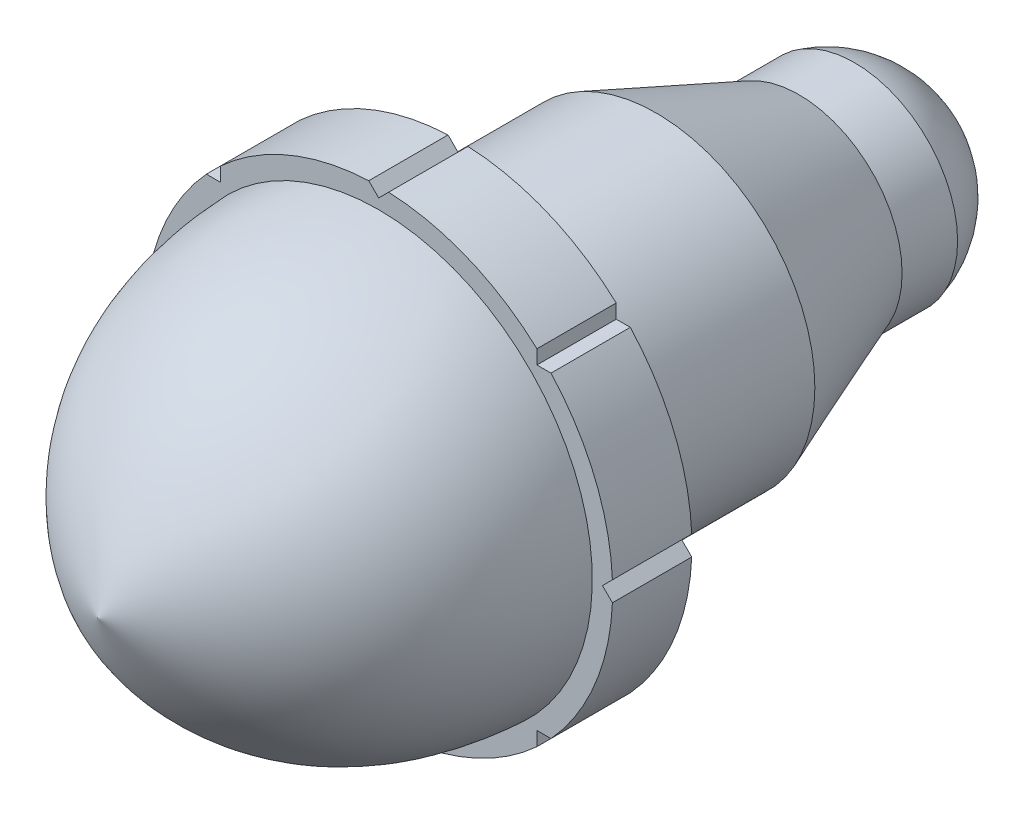
ISO-10303-21;
HEADER;
FILE_DESCRIPTION(('STEP AP214'),'2;1');
FILE_NAME('part.step','',(''),(''),'','','');
FILE_SCHEMA(('AUTOMOTIVE_DESIGN { 1 0 10303 214 1 1 1 1 }'));
ENDSEC;
DATA;
#1=APPLICATION_CONTEXT('core data for automotive mechanical design processes');
#2=APPLICATION_PROTOCOL_DEFINITION('international standard','automotive_design',2000,#1);
#3=PRODUCT_CONTEXT('',#1,'mechanical');
#4=PRODUCT('Part','Part','',(#3));
#5=PRODUCT_RELATED_PRODUCT_CATEGORY('part','',(#4));
#6=PRODUCT_DEFINITION_FORMATION('','',#4);
#7=PRODUCT_DEFINITION_CONTEXT('part definition',#1,'design');
#8=PRODUCT_DEFINITION('design','',#6,#7);
#9=PRODUCT_DEFINITION_SHAPE('','',#8);
#10=(LENGTH_UNIT() NAMED_UNIT(*) SI_UNIT(.MILLI.,.METRE.));
#11=(NAMED_UNIT(*) PLANE_ANGLE_UNIT() SI_UNIT($,.RADIAN.));
#12=(NAMED_UNIT(*) SI_UNIT($,.STERADIAN.) SOLID_ANGLE_UNIT());
#13=UNCERTAINTY_MEASURE_WITH_UNIT(LENGTH_MEASURE(1.E-05),#10,'distance_accuracy_value','');
#14=(GEOMETRIC_REPRESENTATION_CONTEXT(3) GLOBAL_UNCERTAINTY_ASSIGNED_CONTEXT((#13)) GLOBAL_UNIT_ASSIGNED_CONTEXT((#10,
#11,#12)) REPRESENTATION_CONTEXT('',''));
#15=CARTESIAN_POINT('',(0.,0.,0.));
#16=DIRECTION('',(0.,0.,1.));
#17=DIRECTION('',(1.,0.,0.));
#18=AXIS2_PLACEMENT_3D('',#15,#16,#17);
#19=CARTESIAN_POINT('',(0.,0.,9.99924451199761));
#20=DIRECTION('',(0.,0.,1.));
#21=DIRECTION('',(1.,0.,0.));
#22=AXIS2_PLACEMENT_3D('',#19,#20,#21);
#23=CYLINDRICAL_SURFACE('',#22,7.493);
#24=CARTESIAN_POINT('',(0.,0.,0.));
#25=DIRECTION('',(0.,0.,1.));
#26=DIRECTION('',(1.,0.,0.));
#27=AXIS2_PLACEMENT_3D('',#24,#25,#26);
#28=CIRCLE('',#27,7.493);
#29=CARTESIAN_POINT('',(5.51870276522275,-5.06842863115609,0.));
#30=VERTEX_POINT('',#29);
#31=CARTESIAN_POINT('',(7.48623240369248,-0.318391893591497,0.));
#32=VERTEX_POINT('',#31);
#33=EDGE_CURVE('E436',#30,#32,#28,.T.);
#34=ORIENTED_EDGE('',*,*,#33,.T.);
#35=DIRECTION('',(0.,0.,1.));
#36=VECTOR('',#35,1.);
#37=CARTESIAN_POINT('',(7.48623240369248,-0.318391893591497,-15.24));
#38=LINE('',#37,#36);
#39=CARTESIAN_POINT('',(7.48623240369248,-0.318391893591497,2.54));
#40=VERTEX_POINT('',#39);
#41=EDGE_CURVE('E323',#32,#40,#38,.T.);
#42=ORIENTED_EDGE('',*,*,#41,.T.);
#43=CARTESIAN_POINT('',(0.,0.,2.54));
#44=DIRECTION('',(0.,0.,1.));
#45=DIRECTION('',(1.,0.,0.));
#46=AXIS2_PLACEMENT_3D('',#43,#44,#45);
#47=CIRCLE('',#46,7.493);
#48=CARTESIAN_POINT('',(5.51870276522275,-5.06842863115609,2.54));
#49=VERTEX_POINT('',#48);
#50=EDGE_CURVE('E474',#49,#40,#47,.T.);
#51=ORIENTED_EDGE('',*,*,#50,.F.);
#52=DIRECTION('',(0.,0.,1.));
#53=VECTOR('',#52,1.);
#54=CARTESIAN_POINT('',(5.51870276522275,-5.06842863115609,-15.24));
#55=LINE('',#54,#53);
#56=EDGE_CURVE('E340',#30,#49,#55,.T.);
#57=ORIENTED_EDGE('',*,*,#56,.F.);
#58=EDGE_LOOP('',(#34,#42,#51,#57));
#59=FACE_BOUND('',#58,.T.);
#60=ADVANCED_FACE('F55',(#59),#23,.T.);
#61=CARTESIAN_POINT('',(0.318391893591472,-7.48623240369248,0.));
#62=VERTEX_POINT('',#61);
#63=CARTESIAN_POINT('',(5.06842863115603,-5.5187027652228,0.));
#64=VERTEX_POINT('',#63);
#65=EDGE_CURVE('E438',#62,#64,#28,.T.);
#66=ORIENTED_EDGE('',*,*,#65,.T.);
#67=DIRECTION('',(0.,0.,1.));
#68=VECTOR('',#67,1.);
#69=CARTESIAN_POINT('',(5.06842863115603,-5.5187027652228,-15.24));
#70=LINE('',#69,#68);
#71=CARTESIAN_POINT('',(5.06842863115603,-5.5187027652228,2.54));
#72=VERTEX_POINT('',#71);
#73=EDGE_CURVE('E337',#64,#72,#70,.T.);
#74=ORIENTED_EDGE('',*,*,#73,.T.);
#75=CARTESIAN_POINT('',(0.318391893591472,-7.48623240369248,2.54));
#76=VERTEX_POINT('',#75);
#77=EDGE_CURVE('E473',#76,#72,#47,.T.);
#78=ORIENTED_EDGE('',*,*,#77,.F.);
#79=DIRECTION('',(0.,0.,1.));
#80=VECTOR('',#79,1.);
#81=CARTESIAN_POINT('',(0.318391893591472,-7.48623240369248,-15.24));
#82=LINE('',#81,#80);
#83=EDGE_CURVE('E352',#62,#76,#82,.T.);
#84=ORIENTED_EDGE('',*,*,#83,.F.);
#85=EDGE_LOOP('',(#66,#74,#78,#84));
#86=FACE_BOUND('',#85,.T.);
#87=ADVANCED_FACE('F427',(#86),#23,.T.);
#88=CARTESIAN_POINT('',(-5.06842863115611,-5.51870276522273,0.));
#89=VERTEX_POINT('',#88);
#90=CARTESIAN_POINT('',(-0.318391893591471,-7.48623240369248,0.));
#91=VERTEX_POINT('',#90);
#92=EDGE_CURVE('E440',#89,#91,#28,.T.);
#93=ORIENTED_EDGE('',*,*,#92,.T.);
#94=DIRECTION('',(0.,0.,1.));
#95=VECTOR('',#94,1.);
#96=CARTESIAN_POINT('',(-0.318391893591471,-7.48623240369248,-15.24));
#97=LINE('',#96,#95);
#98=CARTESIAN_POINT('',(-0.318391893591471,-7.48623240369248,2.54));
#99=VERTEX_POINT('',#98);
#100=EDGE_CURVE('E350',#91,#99,#97,.T.);
#101=ORIENTED_EDGE('',*,*,#100,.T.);
#102=CARTESIAN_POINT('',(-5.06842863115611,-5.51870276522273,2.54));
#103=VERTEX_POINT('',#102);
#104=EDGE_CURVE('E255',#103,#99,#47,.T.);
#105=ORIENTED_EDGE('',*,*,#104,.F.);
#106=DIRECTION('',(0.,0.,1.));
#107=VECTOR('',#106,1.);
#108=CARTESIAN_POINT('',(-5.06842863115611,-5.51870276522273,-15.24));
#109=LINE('',#108,#107);
#110=EDGE_CURVE('E363',#89,#103,#109,.T.);
#111=ORIENTED_EDGE('',*,*,#110,.F.);
#112=EDGE_LOOP('',(#93,#101,#105,#111));
#113=FACE_BOUND('',#112,.T.);
#114=ADVANCED_FACE('F433',(#113),#23,.T.);
#115=CARTESIAN_POINT('',(-7.48623240369248,-0.318391893591393,0.));
#116=VERTEX_POINT('',#115);
#117=CARTESIAN_POINT('',(-5.51870276522282,-5.06842863115601,0.));
#118=VERTEX_POINT('',#117);
#119=EDGE_CURVE('E452',#116,#118,#28,.T.);
#120=ORIENTED_EDGE('',*,*,#119,.T.);
#121=DIRECTION('',(0.,0.,1.));
#122=VECTOR('',#121,1.);
#123=CARTESIAN_POINT('',(-5.51870276522282,-5.06842863115601,-15.24));
#124=LINE('',#123,#122);
#125=CARTESIAN_POINT('',(-5.51870276522282,-5.06842863115601,2.54));
#126=VERTEX_POINT('',#125);
#127=EDGE_CURVE('E361',#118,#126,#124,.T.);
#128=ORIENTED_EDGE('',*,*,#127,.T.);
#129=CARTESIAN_POINT('',(-7.48623240369248,-0.318391893591393,2.54));
#130=VERTEX_POINT('',#129);
#131=EDGE_CURVE('E249',#130,#126,#47,.T.);
#132=ORIENTED_EDGE('',*,*,#131,.F.);
#133=DIRECTION('',(0.,0.,1.));
#134=VECTOR('',#133,1.);
#135=CARTESIAN_POINT('',(-7.48623240369248,-0.318391893591393,-15.24));
#136=LINE('',#135,#134);
#137=EDGE_CURVE('E240',#116,#130,#136,.T.);
#138=ORIENTED_EDGE('',*,*,#137,.F.);
#139=EDGE_LOOP('',(#120,#128,#132,#138));
#140=FACE_BOUND('',#139,.T.);
#141=ADVANCED_FACE('F495',(#140),#23,.T.);
#142=CARTESIAN_POINT('',(-5.51870276522271,5.06842863115613,0.));
#143=VERTEX_POINT('',#142);
#144=CARTESIAN_POINT('',(-7.48623240369247,0.318391893591549,0.));
#145=VERTEX_POINT('',#144);
#146=EDGE_CURVE('E239',#143,#145,#28,.T.);
#147=ORIENTED_EDGE('',*,*,#146,.T.);
#148=DIRECTION('',(0.,0.,1.));
#149=VECTOR('',#148,1.);
#150=CARTESIAN_POINT('',(-7.48623240369247,0.318391893591549,-15.24));
#151=LINE('',#150,#149);
#152=CARTESIAN_POINT('',(-7.48623240369247,0.318391893591549,2.54));
#153=VERTEX_POINT('',#152);
#154=EDGE_CURVE('E222',#145,#153,#151,.T.);
#155=ORIENTED_EDGE('',*,*,#154,.T.);
#156=CARTESIAN_POINT('',(-5.51870276522271,5.06842863115613,2.54));
#157=VERTEX_POINT('',#156);
#158=EDGE_CURVE('E237',#157,#153,#47,.T.);
#159=ORIENTED_EDGE('',*,*,#158,.F.);
#160=DIRECTION('',(0.,0.,1.));
#161=VECTOR('',#160,1.);
#162=CARTESIAN_POINT('',(-5.51870276522271,5.06842863115613,-15.24));
#163=LINE('',#162,#161);
#164=EDGE_CURVE('E484',#143,#157,#163,.T.);
#165=ORIENTED_EDGE('',*,*,#164,.F.);
#166=EDGE_LOOP('',(#147,#155,#159,#165));
#167=FACE_BOUND('',#166,.T.);
#168=ADVANCED_FACE('F235',(#167),#23,.T.);
#169=CARTESIAN_POINT('',(-0.318391893591472,7.48623240369248,0.));
#170=VERTEX_POINT('',#169);
#171=CARTESIAN_POINT('',(-5.06842863115599,5.51870276522283,0.));
#172=VERTEX_POINT('',#171);
#173=EDGE_CURVE('E258',#170,#172,#28,.T.);
#174=ORIENTED_EDGE('',*,*,#173,.T.);
#175=DIRECTION('',(0.,0.,1.));
#176=VECTOR('',#175,1.);
#177=CARTESIAN_POINT('',(-5.06842863115599,5.51870276522283,-15.24));
#178=LINE('',#177,#176);
#179=CARTESIAN_POINT('',(-5.06842863115599,5.51870276522283,2.54));
#180=VERTEX_POINT('',#179);
#181=EDGE_CURVE('E482',#172,#180,#178,.T.);
#182=ORIENTED_EDGE('',*,*,#181,.T.);
#183=CARTESIAN_POINT('',(-0.318391893591472,7.48623240369248,2.54));
#184=VERTEX_POINT('',#183);
#185=EDGE_CURVE('E248',#184,#180,#47,.T.);
#186=ORIENTED_EDGE('',*,*,#185,.F.);
#187=DIRECTION('',(0.,0.,1.));
#188=VECTOR('',#187,1.);
#189=CARTESIAN_POINT('',(-0.318391893591472,7.48623240369248,-15.24));
#190=LINE('',#189,#188);
#191=EDGE_CURVE('E385',#170,#184,#190,.T.);
#192=ORIENTED_EDGE('',*,*,#191,.F.);
#193=EDGE_LOOP('',(#174,#182,#186,#192));
#194=FACE_BOUND('',#193,.T.);
#195=ADVANCED_FACE('F424',(#194),#23,.T.);
#196=CARTESIAN_POINT('',(7.48623240369248,0.318391893591445,2.54));
#197=VERTEX_POINT('',#196);
#198=CARTESIAN_POINT('',(5.51870276522278,5.06842863115605,2.54));
#199=VERTEX_POINT('',#198);
#200=EDGE_CURVE('E322',#197,#199,#47,.T.);
#201=ORIENTED_EDGE('',*,*,#200,.F.);
#202=DIRECTION('',(0.,0.,1.));
#203=VECTOR('',#202,1.);
#204=CARTESIAN_POINT('',(7.48623240369248,0.318391893591445,-15.24));
#205=LINE('',#204,#203);
#206=CARTESIAN_POINT('',(7.48623240369248,0.318391893591445,0.));
#207=VERTEX_POINT('',#206);
#208=EDGE_CURVE('E315',#207,#197,#205,.T.);
#209=ORIENTED_EDGE('',*,*,#208,.F.);
#210=CARTESIAN_POINT('',(5.51870276522278,5.06842863115605,0.));
#211=VERTEX_POINT('',#210);
#212=EDGE_CURVE('E312',#207,#211,#28,.T.);
#213=ORIENTED_EDGE('',*,*,#212,.T.);
#214=DIRECTION('',(0.,0.,1.));
#215=VECTOR('',#214,1.);
#216=CARTESIAN_POINT('',(5.51870276522278,5.06842863115605,-15.24));
#217=LINE('',#216,#215);
#218=EDGE_CURVE('E371',#211,#199,#217,.T.);
#219=ORIENTED_EDGE('',*,*,#218,.T.);
#220=EDGE_LOOP('',(#201,#209,#213,#219));
#221=FACE_BOUND('',#220,.T.);
#222=ADVANCED_FACE('F319',(#221),#23,.T.);
#223=CARTESIAN_POINT('',(0.,0.,2.54));
#224=DIRECTION('',(0.,0.,-1.));
#225=DIRECTION('',(-1.,0.,0.));
#226=AXIS2_PLACEMENT_3D('',#223,#224,#225);
#227=PLANE('',#226);
#228=CARTESIAN_POINT('',(0.,0.,2.54));
#229=DIRECTION('',(0.,0.,-1.));
#230=DIRECTION('',(-1.,0.,0.));
#231=AXIS2_PLACEMENT_3D('',#228,#229,#230);
#232=CIRCLE('',#231,6.84268102020201);
#233=CARTESIAN_POINT('',(-6.84268102020201,0.,2.54));
#234=VERTEX_POINT('',#233);
#235=EDGE_CURVE('E394',#234,#234,#232,.T.);
#236=ORIENTED_EDGE('',*,*,#235,.T.);
#237=EDGE_LOOP('',(#236));
#238=FACE_BOUND('',#237,.T.);
#239=ORIENTED_EDGE('',*,*,#50,.T.);
#240=DIRECTION('',(0.707106781186546,-0.707106781186548,0.));
#241=VECTOR('',#240,1.);
#242=CARTESIAN_POINT('',(7.167840510101,0.,2.54));
#243=LINE('',#242,#241);
#244=CARTESIAN_POINT('',(7.167840510101,0.,2.54));
#245=VERTEX_POINT('',#244);
#246=EDGE_CURVE('E339',#245,#40,#243,.T.);
#247=ORIENTED_EDGE('',*,*,#246,.F.);
#248=DIRECTION('',(-0.707106781186551,-0.707106781186544,0.));
#249=VECTOR('',#248,1.);
#250=CARTESIAN_POINT('',(7.167840510101,0.,2.54));
#251=LINE('',#250,#249);
#252=EDGE_CURVE('E328',#197,#245,#251,.T.);
#253=ORIENTED_EDGE('',*,*,#252,.F.);
#254=ORIENTED_EDGE('',*,*,#200,.T.);
#255=DIRECTION('',(1.,0.,0.));
#256=VECTOR('',#255,1.);
#257=CARTESIAN_POINT('',(5.06842863115607,5.06842863115605,2.54));
#258=LINE('',#257,#256);
#259=CARTESIAN_POINT('',(5.06842863115607,5.06842863115605,2.54));
#260=VERTEX_POINT('',#259);
#261=EDGE_CURVE('E325',#260,#199,#258,.T.);
#262=ORIENTED_EDGE('',*,*,#261,.F.);
#263=DIRECTION('',(0.,-1.,0.));
#264=VECTOR('',#263,1.);
#265=CARTESIAN_POINT('',(5.06842863115607,5.06842863115605,2.54));
#266=LINE('',#265,#264);
#267=CARTESIAN_POINT('',(5.06842863115607,5.51870276522276,2.54));
#268=VERTEX_POINT('',#267);
#269=EDGE_CURVE('E368',#268,#260,#266,.T.);
#270=ORIENTED_EDGE('',*,*,#269,.F.);
#271=CARTESIAN_POINT('',(0.318391893591471,7.48623240369248,2.54));
#272=VERTEX_POINT('',#271);
#273=EDGE_CURVE('E253',#268,#272,#47,.T.);
#274=ORIENTED_EDGE('',*,*,#273,.T.);
#275=DIRECTION('',(0.707106781186546,0.707106781186549,0.));
#276=VECTOR('',#275,1.);
#277=CARTESIAN_POINT('',(0.,7.167840510101,2.54));
#278=LINE('',#277,#276);
#279=CARTESIAN_POINT('',(0.,7.167840510101,2.54));
#280=VERTEX_POINT('',#279);
#281=EDGE_CURVE('E374',#280,#272,#278,.T.);
#282=ORIENTED_EDGE('',*,*,#281,.F.);
#283=DIRECTION('',(0.707106781186546,-0.707106781186549,0.));
#284=VECTOR('',#283,1.);
#285=CARTESIAN_POINT('',(0.,7.167840510101,2.54));
#286=LINE('',#285,#284);
#287=EDGE_CURVE('E380',#184,#280,#286,.T.);
#288=ORIENTED_EDGE('',*,*,#287,.F.);
#289=ORIENTED_EDGE('',*,*,#185,.T.);
#290=DIRECTION('',(0.,1.,0.));
#291=VECTOR('',#290,1.);
#292=CARTESIAN_POINT('',(-5.068428631156,5.06842863115612,2.54));
#293=LINE('',#292,#291);
#294=CARTESIAN_POINT('',(-5.068428631156,5.06842863115612,2.54));
#295=VERTEX_POINT('',#294);
#296=EDGE_CURVE('E488',#295,#180,#293,.T.);
#297=ORIENTED_EDGE('',*,*,#296,.F.);
#298=DIRECTION('',(1.,0.,0.));
#299=VECTOR('',#298,1.);
#300=CARTESIAN_POINT('',(-5.068428631156,5.06842863115612,2.54));
#301=LINE('',#300,#299);
#302=EDGE_CURVE('E247',#157,#295,#301,.T.);
#303=ORIENTED_EDGE('',*,*,#302,.F.);
#304=ORIENTED_EDGE('',*,*,#158,.T.);
#305=DIRECTION('',(-0.707106781186541,0.707106781186553,0.));
#306=VECTOR('',#305,1.);
#307=CARTESIAN_POINT('',(-7.167840510101,0.,2.54));
#308=LINE('',#307,#306);
#309=CARTESIAN_POINT('',(-7.167840510101,0.,2.54));
#310=VERTEX_POINT('',#309);
#311=EDGE_CURVE('E218',#310,#153,#308,.T.);
#312=ORIENTED_EDGE('',*,*,#311,.F.);
#313=DIRECTION('',(0.707106781186556,0.707106781186539,0.));
#314=VECTOR('',#313,1.);
#315=CARTESIAN_POINT('',(-7.167840510101,0.,2.54));
#316=LINE('',#315,#314);
#317=EDGE_CURVE('E229',#130,#310,#316,.T.);
#318=ORIENTED_EDGE('',*,*,#317,.F.);
#319=ORIENTED_EDGE('',*,*,#131,.T.);
#320=DIRECTION('',(-1.,0.,0.));
#321=VECTOR('',#320,1.);
#322=CARTESIAN_POINT('',(-5.06842863115611,-5.06842863115602,2.54));
#323=LINE('',#322,#321);
#324=CARTESIAN_POINT('',(-5.06842863115611,-5.06842863115602,2.54));
#325=VERTEX_POINT('',#324);
#326=EDGE_CURVE('E356',#325,#126,#323,.T.);
#327=ORIENTED_EDGE('',*,*,#326,.F.);
#328=DIRECTION('',(0.,1.,0.));
#329=VECTOR('',#328,1.);
#330=CARTESIAN_POINT('',(-5.06842863115611,-5.06842863115602,2.54));
#331=LINE('',#330,#329);
#332=EDGE_CURVE('E358',#103,#325,#331,.T.);
#333=ORIENTED_EDGE('',*,*,#332,.F.);
#334=ORIENTED_EDGE('',*,*,#104,.T.);
#335=DIRECTION('',(-0.707106781186546,-0.707106781186549,0.));
#336=VECTOR('',#335,1.);
#337=CARTESIAN_POINT('',(0.,-7.167840510101,2.54));
#338=LINE('',#337,#336);
#339=CARTESIAN_POINT('',(0.,-7.167840510101,2.54));
#340=VERTEX_POINT('',#339);
#341=EDGE_CURVE('E344',#340,#99,#338,.T.);
#342=ORIENTED_EDGE('',*,*,#341,.F.);
#343=DIRECTION('',(-0.707106781186546,0.707106781186549,0.));
#344=VECTOR('',#343,1.);
#345=CARTESIAN_POINT('',(0.,-7.167840510101,2.54));
#346=LINE('',#345,#344);
#347=EDGE_CURVE('E346',#76,#340,#346,.T.);
#348=ORIENTED_EDGE('',*,*,#347,.F.);
#349=ORIENTED_EDGE('',*,*,#77,.T.);
#350=DIRECTION('',(0.,-1.,0.));
#351=VECTOR('',#350,1.);
#352=CARTESIAN_POINT('',(5.06842863115603,-5.06842863115609,2.54));
#353=LINE('',#352,#351);
#354=CARTESIAN_POINT('',(5.06842863115603,-5.06842863115609,2.54));
#355=VERTEX_POINT('',#354);
#356=EDGE_CURVE('E332',#355,#72,#353,.T.);
#357=ORIENTED_EDGE('',*,*,#356,.F.);
#358=DIRECTION('',(-1.,0.,0.));
#359=VECTOR('',#358,1.);
#360=CARTESIAN_POINT('',(5.06842863115603,-5.06842863115609,2.54));
#361=LINE('',#360,#359);
#362=EDGE_CURVE('E334',#49,#355,#361,.T.);
#363=ORIENTED_EDGE('',*,*,#362,.F.);
#364=EDGE_LOOP('',(#239,#247,#253,#254,#262,#270,#274,#282,#288,#289,#297,#303,#304,#312,#318,
#319,#327,#333,#334,#342,#348,#349,#357,#363));
#365=FACE_BOUND('',#364,.T.);
#366=ADVANCED_FACE('F244',(#238,#365),#227,.F.);
#367=ORIENTED_EDGE('',*,*,#273,.F.);
#368=DIRECTION('',(0.,0.,1.));
#369=VECTOR('',#368,1.);
#370=CARTESIAN_POINT('',(5.06842863115607,5.51870276522276,-15.24));
#371=LINE('',#370,#369);
#372=CARTESIAN_POINT('',(5.06842863115607,5.51870276522276,0.));
#373=VERTEX_POINT('',#372);
#374=EDGE_CURVE('E375',#373,#268,#371,.T.);
#375=ORIENTED_EDGE('',*,*,#374,.F.);
#376=CARTESIAN_POINT('',(0.318391893591471,7.48623240369248,0.));
#377=VERTEX_POINT('',#376);
#378=EDGE_CURVE('E441',#373,#377,#28,.T.);
#379=ORIENTED_EDGE('',*,*,#378,.T.);
#380=DIRECTION('',(0.,0.,1.));
#381=VECTOR('',#380,1.);
#382=CARTESIAN_POINT('',(0.318391893591471,7.48623240369248,-15.24));
#383=LINE('',#382,#381);
#384=EDGE_CURVE('E383',#377,#272,#383,.T.);
#385=ORIENTED_EDGE('',*,*,#384,.T.);
#386=EDGE_LOOP('',(#367,#375,#379,#385));
#387=FACE_BOUND('',#386,.T.);
#388=ADVANCED_FACE('F416',(#387),#23,.T.);
#389=CARTESIAN_POINT('',(0.,7.493,0.));
#390=DIRECTION('',(0.,0.,1.));
#391=DIRECTION('',(1.,0.,0.));
#392=AXIS2_PLACEMENT_3D('',#389,#390,#391);
#393=PLANE('',#392);
#394=DIRECTION('',(-0.707106781186551,-0.707106781186544,0.));
#395=VECTOR('',#394,1.);
#396=CARTESIAN_POINT('',(7.33042025505048,0.162579744949445,0.));
#397=LINE('',#396,#395);
#398=CARTESIAN_POINT('',(7.167840510101,0.,0.));
#399=VERTEX_POINT('',#398);
#400=EDGE_CURVE('E63',#207,#399,#397,.T.);
#401=ORIENTED_EDGE('',*,*,#400,.T.);
#402=DIRECTION('',(0.707106781186547,-0.707106781186549,0.));
#403=VECTOR('',#402,1.);
#404=CARTESIAN_POINT('',(-0.162579744949501,7.3304202550505,0.));
#405=LINE('',#404,#403);
#406=EDGE_CURVE('E13',#399,#32,#405,.T.);
#407=ORIENTED_EDGE('',*,*,#406,.T.);
#408=ORIENTED_EDGE('',*,*,#33,.F.);
#409=DIRECTION('',(-1.,0.,0.));
#410=VECTOR('',#409,1.);
#411=CARTESIAN_POINT('',(0.,-5.06842863115605,0.));
#412=LINE('',#411,#410);
#413=CARTESIAN_POINT('',(5.06842863115603,-5.06842863115609,0.));
#414=VERTEX_POINT('',#413);
#415=EDGE_CURVE('E299',#30,#414,#412,.T.);
#416=ORIENTED_EDGE('',*,*,#415,.T.);
#417=DIRECTION('',(0.,-1.,0.));
#418=VECTOR('',#417,1.);
#419=CARTESIAN_POINT('',(5.06842863115607,7.49299999999998,0.));
#420=LINE('',#419,#418);
#421=EDGE_CURVE('E302',#414,#64,#420,.T.);
#422=ORIENTED_EDGE('',*,*,#421,.T.);
#423=ORIENTED_EDGE('',*,*,#65,.F.);
#424=DIRECTION('',(-0.707106781186546,0.707106781186549,0.));
#425=VECTOR('',#424,1.);
#426=CARTESIAN_POINT('',(-7.3304202550505,0.162579744949529,0.));
#427=LINE('',#426,#425);
#428=CARTESIAN_POINT('',(0.,-7.167840510101,0.));
#429=VERTEX_POINT('',#428);
#430=EDGE_CURVE('E293',#62,#429,#427,.T.);
#431=ORIENTED_EDGE('',*,*,#430,.T.);
#432=DIRECTION('',(-0.707106781186546,-0.707106781186549,0.));
#433=VECTOR('',#432,1.);
#434=CARTESIAN_POINT('',(7.3304202550505,0.162579744949529,0.));
#435=LINE('',#434,#433);
#436=EDGE_CURVE('E296',#429,#91,#435,.T.);
#437=ORIENTED_EDGE('',*,*,#436,.T.);
#438=ORIENTED_EDGE('',*,*,#92,.F.);
#439=DIRECTION('',(0.,1.,0.));
#440=VECTOR('',#439,1.);
#441=CARTESIAN_POINT('',(-5.06842863115597,7.49300000000005,0.));
#442=LINE('',#441,#440);
#443=CARTESIAN_POINT('',(-5.06842863115611,-5.06842863115602,0.));
#444=VERTEX_POINT('',#443);
#445=EDGE_CURVE('E287',#89,#444,#442,.T.);
#446=ORIENTED_EDGE('',*,*,#445,.T.);
#447=DIRECTION('',(-1.,0.,0.));
#448=VECTOR('',#447,1.);
#449=CARTESIAN_POINT('',(0.,-5.06842863115605,0.));
#450=LINE('',#449,#448);
#451=EDGE_CURVE('E290',#444,#118,#450,.T.);
#452=ORIENTED_EDGE('',*,*,#451,.T.);
#453=ORIENTED_EDGE('',*,*,#119,.F.);
#454=DIRECTION('',(0.707106781186556,0.707106781186539,0.));
#455=VECTOR('',#454,1.);
#456=CARTESIAN_POINT('',(0.162579744949551,7.33042025505044,0.));
#457=LINE('',#456,#455);
#458=CARTESIAN_POINT('',(-7.167840510101,0.,0.));
#459=VERTEX_POINT('',#458);
#460=EDGE_CURVE('E282',#116,#459,#457,.T.);
#461=ORIENTED_EDGE('',*,*,#460,.T.);
#462=DIRECTION('',(-0.707106781186542,0.707106781186554,0.));
#463=VECTOR('',#462,1.);
#464=CARTESIAN_POINT('',(-7.33042025505052,0.162579744949601,0.));
#465=LINE('',#464,#463);
#466=EDGE_CURVE('E285',#459,#145,#465,.T.);
#467=ORIENTED_EDGE('',*,*,#466,.T.);
#468=ORIENTED_EDGE('',*,*,#146,.F.);
#469=DIRECTION('',(1.,0.,0.));
#470=VECTOR('',#469,1.);
#471=CARTESIAN_POINT('',(0.,5.06842863115605,0.));
#472=LINE('',#471,#470);
#473=CARTESIAN_POINT('',(-5.068428631156,5.06842863115612,0.));
#474=VERTEX_POINT('',#473);
#475=EDGE_CURVE('E276',#143,#474,#472,.T.);
#476=ORIENTED_EDGE('',*,*,#475,.T.);
#477=DIRECTION('',(0.,1.,0.));
#478=VECTOR('',#477,1.);
#479=CARTESIAN_POINT('',(-5.06842863115598,7.49300000000005,0.));
#480=LINE('',#479,#478);
#481=EDGE_CURVE('E279',#474,#172,#480,.T.);
#482=ORIENTED_EDGE('',*,*,#481,.T.);
#483=ORIENTED_EDGE('',*,*,#173,.F.);
#484=DIRECTION('',(0.707106781186546,-0.707106781186549,0.));
#485=VECTOR('',#484,1.);
#486=CARTESIAN_POINT('',(-0.162579744949498,7.3304202550505,0.));
#487=LINE('',#486,#485);
#488=CARTESIAN_POINT('',(0.,7.167840510101,0.));
#489=VERTEX_POINT('',#488);
#490=EDGE_CURVE('E252',#170,#489,#487,.T.);
#491=ORIENTED_EDGE('',*,*,#490,.T.);
#492=DIRECTION('',(0.707106781186546,0.707106781186549,0.));
#493=VECTOR('',#492,1.);
#494=CARTESIAN_POINT('',(0.162579744949498,7.3304202550505,0.));
#495=LINE('',#494,#493);
#496=EDGE_CURVE('E267',#489,#377,#495,.T.);
#497=ORIENTED_EDGE('',*,*,#496,.T.);
#498=ORIENTED_EDGE('',*,*,#378,.F.);
#499=DIRECTION('',(0.,-1.,0.));
#500=VECTOR('',#499,1.);
#501=CARTESIAN_POINT('',(5.06842863115608,7.49299999999998,0.));
#502=LINE('',#501,#500);
#503=CARTESIAN_POINT('',(5.06842863115607,5.06842863115605,0.));
#504=VERTEX_POINT('',#503);
#505=EDGE_CURVE('E270',#373,#504,#502,.T.);
#506=ORIENTED_EDGE('',*,*,#505,.T.);
#507=DIRECTION('',(1.,0.,0.));
#508=VECTOR('',#507,1.);
#509=CARTESIAN_POINT('',(0.,5.06842863115605,0.));
#510=LINE('',#509,#508);
#511=EDGE_CURVE('E273',#504,#211,#510,.T.);
#512=ORIENTED_EDGE('',*,*,#511,.T.);
#513=ORIENTED_EDGE('',*,*,#212,.F.);
#514=EDGE_LOOP('',(#401,#407,#408,#416,#422,#423,#431,#437,#438,#446,#452,#453,#461,#467,#468,
#476,#482,#483,#491,#497,#498,#506,#512,#513));
#515=FACE_BOUND('',#514,.T.);
#516=CARTESIAN_POINT('',(0.,0.,0.));
#517=DIRECTION('',(0.,0.,1.));
#518=DIRECTION('',(1.,0.,0.));
#519=AXIS2_PLACEMENT_3D('',#516,#517,#518);
#520=CIRCLE('',#519,5.08);
#521=CARTESIAN_POINT('',(5.08,0.,0.));
#522=VERTEX_POINT('',#521);
#523=EDGE_CURVE('E442',#522,#522,#520,.T.);
#524=ORIENTED_EDGE('',*,*,#523,.T.);
#525=EDGE_LOOP('',(#524));
#526=FACE_BOUND('',#525,.T.);
#527=ADVANCED_FACE('F307',(#515,#526),#393,.F.);
#528=CARTESIAN_POINT('',(0.,0.,9.99924451199761));
#529=DIRECTION('',(0.,0.,1.));
#530=DIRECTION('',(1.,0.,0.));
#531=AXIS2_PLACEMENT_3D('',#528,#529,#530);
#532=CYLINDRICAL_SURFACE('',#531,5.08);
#533=CARTESIAN_POINT('',(0.,0.,-6.35));
#534=DIRECTION('',(0.,0.,1.));
#535=DIRECTION('',(1.,0.,0.));
#536=AXIS2_PLACEMENT_3D('',#533,#534,#535);
#537=CIRCLE('',#536,5.08);
#538=CARTESIAN_POINT('',(5.08,0.,-6.35));
#539=VERTEX_POINT('',#538);
#540=EDGE_CURVE('E263',#539,#539,#537,.T.);
#541=ORIENTED_EDGE('',*,*,#540,.T.);
#542=EDGE_LOOP('',(#541));
#543=FACE_BOUND('',#542,.T.);
#544=ORIENTED_EDGE('',*,*,#523,.F.);
#545=EDGE_LOOP('',(#544));
#546=FACE_BOUND('',#545,.T.);
#547=ADVANCED_FACE('F408',(#543,#546),#532,.T.);
#548=CARTESIAN_POINT('',(0.,6.84268102020201,2.54));
#549=CARTESIAN_POINT('',(0.,6.52533298328885,9.18957974912331));
#550=CARTESIAN_POINT('',(0.,0.,11.5311980628352));
#551=B_SPLINE_CURVE_WITH_KNOTS('',2,(#548,#549,#550),.UNSPECIFIED.,.F.,.F.,(3,3),(0.,1.),.UNSPECIFIED.);
#552=CARTESIAN_POINT('',(0.,0.,0.));
#553=DIRECTION('',(0.,0.,-1.));
#554=AXIS1_PLACEMENT('',#552,#553);
#555=SURFACE_OF_REVOLUTION('',#551,#554);
#556=CARTESIAN_POINT('',(0.,0.,11.5311980628352));
#557=VERTEX_POINT('',#556);
#558=VERTEX_LOOP('',#557);
#559=FACE_BOUND('',#558,.T.);
#560=ORIENTED_EDGE('',*,*,#235,.F.);
#561=EDGE_LOOP('',(#560));
#562=FACE_BOUND('',#561,.T.);
#563=ADVANCED_FACE('F403',(#559,#562),#555,.F.);
#564=CARTESIAN_POINT('',(0.,0.,14.8107368778698));
#565=DIRECTION('',(0.,0.,1.));
#566=DIRECTION('',(1.,0.,0.));
#567=AXIS2_PLACEMENT_3D('',#564,#565,#566);
#568=CYLINDRICAL_SURFACE('',#567,3.302);
#569=CARTESIAN_POINT('',(0.,0.,-12.7));
#570=DIRECTION('',(0.,0.,1.));
#571=DIRECTION('',(1.,0.,0.));
#572=AXIS2_PLACEMENT_3D('',#569,#570,#571);
#573=CIRCLE('',#572,3.302);
#574=CARTESIAN_POINT('',(3.302,0.,-12.7));
#575=VERTEX_POINT('',#574);
#576=EDGE_CURVE('E260',#575,#575,#573,.T.);
#577=ORIENTED_EDGE('',*,*,#576,.T.);
#578=EDGE_LOOP('',(#577));
#579=FACE_BOUND('',#578,.T.);
#580=CARTESIAN_POINT('',(0.,0.,-10.922));
#581=DIRECTION('',(0.,0.,1.));
#582=DIRECTION('',(1.,0.,0.));
#583=AXIS2_PLACEMENT_3D('',#580,#581,#582);
#584=CIRCLE('',#583,3.302);
#585=CARTESIAN_POINT('',(3.302,0.,-10.922));
#586=VERTEX_POINT('',#585);
#587=EDGE_CURVE('E391',#586,#586,#584,.T.);
#588=ORIENTED_EDGE('',*,*,#587,.F.);
#589=EDGE_LOOP('',(#588));
#590=FACE_BOUND('',#589,.T.);
#591=ADVANCED_FACE('F407',(#579,#590),#568,.T.);
#592=CARTESIAN_POINT('',(0.,0.,-6.35));
#593=DIRECTION('',(0.,0.,1.));
#594=DIRECTION('',(1.,0.,0.));
#595=AXIS2_PLACEMENT_3D('',#592,#593,#594);
#596=CONICAL_SURFACE('',#595,5.08,0.370891288812662);
#597=ORIENTED_EDGE('',*,*,#587,.T.);
#598=EDGE_LOOP('',(#597));
#599=FACE_BOUND('',#598,.T.);
#600=ORIENTED_EDGE('',*,*,#540,.F.);
#601=EDGE_LOOP('',(#600));
#602=FACE_BOUND('',#601,.T.);
#603=ADVANCED_FACE('F529',(#599,#602),#596,.T.);
#604=CARTESIAN_POINT('',(0.,0.,-11.8237));
#605=DIRECTION('',(0.,0.,1.));
#606=DIRECTION('',(1.,0.,0.));
#607=AXIS2_PLACEMENT_3D('',#604,#605,#606);
#608=SPHERICAL_SURFACE('',#607,3.4163);
#609=ORIENTED_EDGE('',*,*,#576,.F.);
#610=EDGE_LOOP('',(#609));
#611=FACE_BOUND('',#610,.T.);
#612=ADVANCED_FACE('F57',(#611),#608,.T.);
#613=CARTESIAN_POINT('',(0.,7.167840510101,-15.24));
#614=DIRECTION('',(0.707106781186549,-0.707106781186546,0.));
#615=DIRECTION('',(0.707106781186546,0.707106781186549,0.));
#616=AXIS2_PLACEMENT_3D('',#613,#614,#615);
#617=PLANE('',#616);
#618=DIRECTION('',(0.,0.,1.));
#619=VECTOR('',#618,1.);
#620=CARTESIAN_POINT('',(0.,7.167840510101,-15.24));
#621=LINE('',#620,#619);
#622=EDGE_CURVE('E264',#489,#280,#621,.T.);
#623=ORIENTED_EDGE('',*,*,#622,.T.);
#624=ORIENTED_EDGE('',*,*,#281,.T.);
#625=ORIENTED_EDGE('',*,*,#384,.F.);
#626=ORIENTED_EDGE('',*,*,#496,.F.);
#627=EDGE_LOOP('',(#623,#624,#625,#626));
#628=FACE_BOUND('',#627,.T.);
#629=ADVANCED_FACE('F511',(#628),#617,.F.);
#630=CARTESIAN_POINT('',(0.,7.167840510101,-15.24));
#631=DIRECTION('',(-0.707106781186549,-0.707106781186546,0.));
#632=DIRECTION('',(0.707106781186546,-0.707106781186549,0.));
#633=AXIS2_PLACEMENT_3D('',#630,#631,#632);
#634=PLANE('',#633);
#635=ORIENTED_EDGE('',*,*,#191,.T.);
#636=ORIENTED_EDGE('',*,*,#287,.T.);
#637=ORIENTED_EDGE('',*,*,#622,.F.);
#638=ORIENTED_EDGE('',*,*,#490,.F.);
#639=EDGE_LOOP('',(#635,#636,#637,#638));
#640=FACE_BOUND('',#639,.T.);
#641=ADVANCED_FACE('F508',(#640),#634,.F.);
#642=CARTESIAN_POINT('',(5.06842863115607,5.06842863115605,-15.24));
#643=DIRECTION('',(0.,-1.,0.));
#644=DIRECTION('',(1.,0.,0.));
#645=AXIS2_PLACEMENT_3D('',#642,#643,#644);
#646=PLANE('',#645);
#647=DIRECTION('',(0.,0.,1.));
#648=VECTOR('',#647,1.);
#649=CARTESIAN_POINT('',(5.06842863115607,5.06842863115605,-15.24));
#650=LINE('',#649,#648);
#651=EDGE_CURVE('E372',#504,#260,#650,.T.);
#652=ORIENTED_EDGE('',*,*,#651,.T.);
#653=ORIENTED_EDGE('',*,*,#261,.T.);
#654=ORIENTED_EDGE('',*,*,#218,.F.);
#655=ORIENTED_EDGE('',*,*,#511,.F.);
#656=EDGE_LOOP('',(#652,#653,#654,#655));
#657=FACE_BOUND('',#656,.T.);
#658=ADVANCED_FACE('F517',(#657),#646,.F.);
#659=CARTESIAN_POINT('',(5.06842863115607,5.06842863115605,-15.24));
#660=DIRECTION('',(-1.,0.,0.));
#661=DIRECTION('',(0.,-1.,0.));
#662=AXIS2_PLACEMENT_3D('',#659,#660,#661);
#663=PLANE('',#662);
#664=ORIENTED_EDGE('',*,*,#374,.T.);
#665=ORIENTED_EDGE('',*,*,#269,.T.);
#666=ORIENTED_EDGE('',*,*,#651,.F.);
#667=ORIENTED_EDGE('',*,*,#505,.F.);
#668=EDGE_LOOP('',(#664,#665,#666,#667));
#669=FACE_BOUND('',#668,.T.);
#670=ADVANCED_FACE('F514',(#669),#663,.F.);
#671=CARTESIAN_POINT('',(-5.068428631156,5.06842863115612,-15.24));
#672=DIRECTION('',(1.,0.,0.));
#673=DIRECTION('',(0.,1.,0.));
#674=AXIS2_PLACEMENT_3D('',#671,#672,#673);
#675=PLANE('',#674);
#676=DIRECTION('',(0.,0.,1.));
#677=VECTOR('',#676,1.);
#678=CARTESIAN_POINT('',(-5.068428631156,5.06842863115612,-15.24));
#679=LINE('',#678,#677);
#680=EDGE_CURVE('E230',#474,#295,#679,.T.);
#681=ORIENTED_EDGE('',*,*,#680,.T.);
#682=ORIENTED_EDGE('',*,*,#296,.T.);
#683=ORIENTED_EDGE('',*,*,#181,.F.);
#684=ORIENTED_EDGE('',*,*,#481,.F.);
#685=EDGE_LOOP('',(#681,#682,#683,#684));
#686=FACE_BOUND('',#685,.T.);
#687=ADVANCED_FACE('F503',(#686),#675,.F.);
#688=CARTESIAN_POINT('',(-5.068428631156,5.06842863115612,-15.24));
#689=DIRECTION('',(0.,-1.,0.));
#690=DIRECTION('',(1.,0.,0.));
#691=AXIS2_PLACEMENT_3D('',#688,#689,#690);
#692=PLANE('',#691);
#693=ORIENTED_EDGE('',*,*,#164,.T.);
#694=ORIENTED_EDGE('',*,*,#302,.T.);
#695=ORIENTED_EDGE('',*,*,#680,.F.);
#696=ORIENTED_EDGE('',*,*,#475,.F.);
#697=EDGE_LOOP('',(#693,#694,#695,#696));
#698=FACE_BOUND('',#697,.T.);
#699=ADVANCED_FACE('F501',(#698),#692,.F.);
#700=CARTESIAN_POINT('',(-7.167840510101,0.,-15.24));
#701=DIRECTION('',(0.707106781186553,0.707106781186541,0.));
#702=DIRECTION('',(-0.707106781186542,0.707106781186554,0.));
#703=AXIS2_PLACEMENT_3D('',#700,#701,#702);
#704=PLANE('',#703);
#705=DIRECTION('',(0.,0.,1.));
#706=VECTOR('',#705,1.);
#707=CARTESIAN_POINT('',(-7.167840510101,0.,-15.24));
#708=LINE('',#707,#706);
#709=EDGE_CURVE('E224',#459,#310,#708,.T.);
#710=ORIENTED_EDGE('',*,*,#709,.T.);
#711=ORIENTED_EDGE('',*,*,#311,.T.);
#712=ORIENTED_EDGE('',*,*,#154,.F.);
#713=ORIENTED_EDGE('',*,*,#466,.F.);
#714=EDGE_LOOP('',(#710,#711,#712,#713));
#715=FACE_BOUND('',#714,.T.);
#716=ADVANCED_FACE('F220',(#715),#704,.F.);
#717=CARTESIAN_POINT('',(-7.167840510101,0.,-15.24));
#718=DIRECTION('',(0.707106781186539,-0.707106781186556,0.));
#719=DIRECTION('',(0.707106781186556,0.707106781186539,0.));
#720=AXIS2_PLACEMENT_3D('',#717,#718,#719);
#721=PLANE('',#720);
#722=ORIENTED_EDGE('',*,*,#137,.T.);
#723=ORIENTED_EDGE('',*,*,#317,.T.);
#724=ORIENTED_EDGE('',*,*,#709,.F.);
#725=ORIENTED_EDGE('',*,*,#460,.F.);
#726=EDGE_LOOP('',(#722,#723,#724,#725));
#727=FACE_BOUND('',#726,.T.);
#728=ADVANCED_FACE('F493',(#727),#721,.F.);
#729=CARTESIAN_POINT('',(-5.06842863115611,-5.06842863115602,-15.24));
#730=DIRECTION('',(0.,1.,0.));
#731=DIRECTION('',(-1.,0.,0.));
#732=AXIS2_PLACEMENT_3D('',#729,#730,#731);
#733=PLANE('',#732);
#734=DIRECTION('',(0.,0.,1.));
#735=VECTOR('',#734,1.);
#736=CARTESIAN_POINT('',(-5.06842863115611,-5.06842863115602,-15.24));
#737=LINE('',#736,#735);
#738=EDGE_CURVE('E347',#444,#325,#737,.T.);
#739=ORIENTED_EDGE('',*,*,#738,.T.);
#740=ORIENTED_EDGE('',*,*,#326,.T.);
#741=ORIENTED_EDGE('',*,*,#127,.F.);
#742=ORIENTED_EDGE('',*,*,#451,.F.);
#743=EDGE_LOOP('',(#739,#740,#741,#742));
#744=FACE_BOUND('',#743,.T.);
#745=ADVANCED_FACE('F498',(#744),#733,.F.);
#746=CARTESIAN_POINT('',(-5.06842863115611,-5.06842863115602,-15.24));
#747=DIRECTION('',(1.,0.,0.));
#748=DIRECTION('',(0.,1.,0.));
#749=AXIS2_PLACEMENT_3D('',#746,#747,#748);
#750=PLANE('',#749);
#751=ORIENTED_EDGE('',*,*,#110,.T.);
#752=ORIENTED_EDGE('',*,*,#332,.T.);
#753=ORIENTED_EDGE('',*,*,#738,.F.);
#754=ORIENTED_EDGE('',*,*,#445,.F.);
#755=EDGE_LOOP('',(#751,#752,#753,#754));
#756=FACE_BOUND('',#755,.T.);
#757=ADVANCED_FACE('F653',(#756),#750,.F.);
#758=CARTESIAN_POINT('',(0.,-7.167840510101,-15.24));
#759=DIRECTION('',(-0.707106781186549,0.707106781186546,0.));
#760=DIRECTION('',(-0.707106781186546,-0.707106781186549,0.));
#761=AXIS2_PLACEMENT_3D('',#758,#759,#760);
#762=PLANE('',#761);
#763=DIRECTION('',(0.,0.,1.));
#764=VECTOR('',#763,1.);
#765=CARTESIAN_POINT('',(0.,-7.167840510101,-15.24));
#766=LINE('',#765,#764);
#767=EDGE_CURVE('E335',#429,#340,#766,.T.);
#768=ORIENTED_EDGE('',*,*,#767,.T.);
#769=ORIENTED_EDGE('',*,*,#341,.T.);
#770=ORIENTED_EDGE('',*,*,#100,.F.);
#771=ORIENTED_EDGE('',*,*,#436,.F.);
#772=EDGE_LOOP('',(#768,#769,#770,#771));
#773=FACE_BOUND('',#772,.T.);
#774=ADVANCED_FACE('F466',(#773),#762,.F.);
#775=CARTESIAN_POINT('',(0.,-7.167840510101,-15.24));
#776=DIRECTION('',(0.707106781186549,0.707106781186546,0.));
#777=DIRECTION('',(-0.707106781186546,0.707106781186549,0.));
#778=AXIS2_PLACEMENT_3D('',#775,#776,#777);
#779=PLANE('',#778);
#780=ORIENTED_EDGE('',*,*,#83,.T.);
#781=ORIENTED_EDGE('',*,*,#347,.T.);
#782=ORIENTED_EDGE('',*,*,#767,.F.);
#783=ORIENTED_EDGE('',*,*,#430,.F.);
#784=EDGE_LOOP('',(#780,#781,#782,#783));
#785=FACE_BOUND('',#784,.T.);
#786=ADVANCED_FACE('F668',(#785),#779,.F.);
#787=CARTESIAN_POINT('',(5.06842863115603,-5.06842863115609,-15.24));
#788=DIRECTION('',(-1.,0.,0.));
#789=DIRECTION('',(0.,-1.,0.));
#790=AXIS2_PLACEMENT_3D('',#787,#788,#789);
#791=PLANE('',#790);
#792=DIRECTION('',(0.,0.,1.));
#793=VECTOR('',#792,1.);
#794=CARTESIAN_POINT('',(5.06842863115603,-5.06842863115609,-15.24));
#795=LINE('',#794,#793);
#796=EDGE_CURVE('E78',#414,#355,#795,.T.);
#797=ORIENTED_EDGE('',*,*,#796,.T.);
#798=ORIENTED_EDGE('',*,*,#356,.T.);
#799=ORIENTED_EDGE('',*,*,#73,.F.);
#800=ORIENTED_EDGE('',*,*,#421,.F.);
#801=EDGE_LOOP('',(#797,#798,#799,#800));
#802=FACE_BOUND('',#801,.T.);
#803=ADVANCED_FACE('F676',(#802),#791,.F.);
#804=CARTESIAN_POINT('',(5.06842863115603,-5.06842863115609,-15.24));
#805=DIRECTION('',(0.,1.,0.));
#806=DIRECTION('',(-1.,0.,0.));
#807=AXIS2_PLACEMENT_3D('',#804,#805,#806);
#808=PLANE('',#807);
#809=ORIENTED_EDGE('',*,*,#56,.T.);
#810=ORIENTED_EDGE('',*,*,#362,.T.);
#811=ORIENTED_EDGE('',*,*,#796,.F.);
#812=ORIENTED_EDGE('',*,*,#415,.F.);
#813=EDGE_LOOP('',(#809,#810,#811,#812));
#814=FACE_BOUND('',#813,.T.);
#815=ADVANCED_FACE('F685',(#814),#808,.F.);
#816=CARTESIAN_POINT('',(7.167840510101,0.,-15.24));
#817=DIRECTION('',(-0.707106781186548,-0.707106781186546,0.));
#818=DIRECTION('',(0.707106781186547,-0.707106781186549,0.));
#819=AXIS2_PLACEMENT_3D('',#816,#817,#818);
#820=PLANE('',#819);
#821=DIRECTION('',(0.,0.,1.));
#822=VECTOR('',#821,1.);
#823=CARTESIAN_POINT('',(7.167840510101,0.,-15.24));
#824=LINE('',#823,#822);
#825=EDGE_CURVE('E70',#399,#245,#824,.T.);
#826=ORIENTED_EDGE('',*,*,#825,.T.);
#827=ORIENTED_EDGE('',*,*,#246,.T.);
#828=ORIENTED_EDGE('',*,*,#41,.F.);
#829=ORIENTED_EDGE('',*,*,#406,.F.);
#830=EDGE_LOOP('',(#826,#827,#828,#829));
#831=FACE_BOUND('',#830,.T.);
#832=ADVANCED_FACE('F694',(#831),#820,.F.);
#833=CARTESIAN_POINT('',(7.167840510101,0.,-15.24));
#834=DIRECTION('',(-0.707106781186544,0.707106781186551,0.));
#835=DIRECTION('',(-0.707106781186551,-0.707106781186544,0.));
#836=AXIS2_PLACEMENT_3D('',#833,#834,#835);
#837=PLANE('',#836);
#838=ORIENTED_EDGE('',*,*,#208,.T.);
#839=ORIENTED_EDGE('',*,*,#252,.T.);
#840=ORIENTED_EDGE('',*,*,#825,.F.);
#841=ORIENTED_EDGE('',*,*,#400,.F.);
#842=EDGE_LOOP('',(#838,#839,#840,#841));
#843=FACE_BOUND('',#842,.T.);
#844=ADVANCED_FACE('F314',(#843),#837,.F.);
#845=CLOSED_SHELL('',(#60,#87,#114,#141,#168,#195,#222,#366,#388,#527,#547,#563,#591,#603,#612,
#629,#641,#658,#670,#687,#699,#716,#728,#745,#757,#774,#786,#803,#815,#832,#844));
#846=MANIFOLD_SOLID_BREP('B2',#845);
#847=ADVANCED_BREP_SHAPE_REPRESENTATION('',(#18,#846),#14);
#848=SHAPE_DEFINITION_REPRESENTATION(#9,#847);
ENDSEC;
END-ISO-10303-21;
